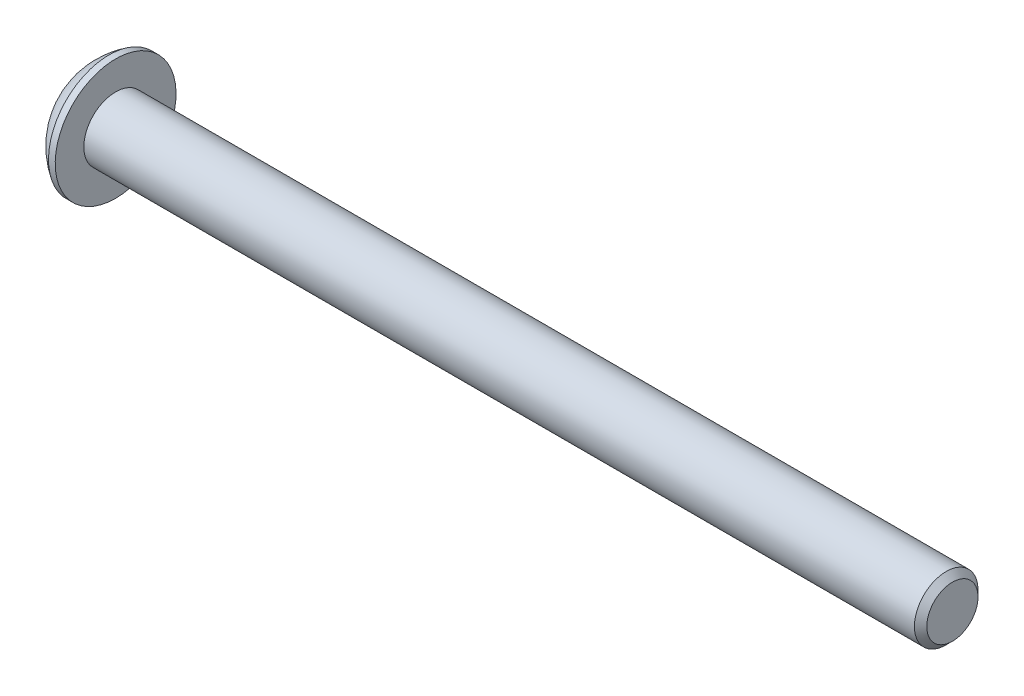
ISO-10303-21;
HEADER;
FILE_DESCRIPTION(('STEP AP214'),'2;1');
FILE_NAME('part.step','',(''),(''),'','','');
FILE_SCHEMA(('AUTOMOTIVE_DESIGN { 1 0 10303 214 1 1 1 1 }'));
ENDSEC;
DATA;
#1=APPLICATION_CONTEXT('core data for automotive mechanical design processes');
#2=APPLICATION_PROTOCOL_DEFINITION('international standard','automotive_design',2000,#1);
#3=PRODUCT_CONTEXT('',#1,'mechanical');
#4=PRODUCT('Part','Part','',(#3));
#5=PRODUCT_RELATED_PRODUCT_CATEGORY('part','',(#4));
#6=PRODUCT_DEFINITION_FORMATION('','',#4);
#7=PRODUCT_DEFINITION_CONTEXT('part definition',#1,'design');
#8=PRODUCT_DEFINITION('design','',#6,#7);
#9=PRODUCT_DEFINITION_SHAPE('','',#8);
#10=(LENGTH_UNIT() NAMED_UNIT(*) SI_UNIT(.MILLI.,.METRE.));
#11=(NAMED_UNIT(*) PLANE_ANGLE_UNIT() SI_UNIT($,.RADIAN.));
#12=(NAMED_UNIT(*) SI_UNIT($,.STERADIAN.) SOLID_ANGLE_UNIT());
#13=UNCERTAINTY_MEASURE_WITH_UNIT(LENGTH_MEASURE(1.E-05),#10,'distance_accuracy_value','');
#14=(GEOMETRIC_REPRESENTATION_CONTEXT(3) GLOBAL_UNCERTAINTY_ASSIGNED_CONTEXT((#13)) GLOBAL_UNIT_ASSIGNED_CONTEXT((#10,
#11,#12)) REPRESENTATION_CONTEXT('',''));
#15=CARTESIAN_POINT('',(0.,0.,0.));
#16=DIRECTION('',(0.,0.,1.));
#17=DIRECTION('',(1.,0.,0.));
#18=AXIS2_PLACEMENT_3D('',#15,#16,#17);
#19=CARTESIAN_POINT('',(1.77799999999984,-1.77615332584927E-12,-1.0547118733939E-12));
#20=DIRECTION('',(-1.,0.,0.));
#21=DIRECTION('',(0.,-1.,0.));
#22=AXIS2_PLACEMENT_3D('',#19,#20,#21);
#23=CONICAL_SURFACE('',#22,1.58750000000069,1.04719755119657);
#24=CARTESIAN_POINT('',(2.69454355233878,-1.7763568394003E-12,-1.11022302462516E-12));
#25=VERTEX_POINT('',#24);
#26=VERTEX_LOOP('',#25);
#27=FACE_BOUND('',#26,.T.);
#28=CARTESIAN_POINT('',(1.77800000000039,-1.77615332584927E-12,-1.0547118733939E-12));
#29=DIRECTION('',(-1.,0.,0.));
#30=DIRECTION('',(0.,-1.,0.));
#31=AXIS2_PLACEMENT_3D('',#28,#29,#30);
#32=CIRCLE('',#31,1.5874999999998);
#33=CARTESIAN_POINT('',(1.77800000000011,-1.77769549501942E-12,1.58749999999908));
#34=VERTEX_POINT('',#33);
#35=CARTESIAN_POINT('',(1.77800000000022,-1.37481532850896,0.793749999998839));
#36=VERTEX_POINT('',#35);
#37=EDGE_CURVE('E20',#34,#36,#32,.F.);
#38=ORIENTED_EDGE('',*,*,#37,.F.);
#39=CARTESIAN_POINT('',(1.77799999999984,-1.77615332584927E-12,-1.0547118733939E-12));
#40=DIRECTION('',(-1.,0.,0.));
#41=DIRECTION('',(0.,-1.,0.));
#42=AXIS2_PLACEMENT_3D('',#39,#40,#41);
#43=CIRCLE('',#42,1.58750000000069);
#44=CARTESIAN_POINT('',(1.77800000000009,1.37481532850634,0.793749999998971));
#45=VERTEX_POINT('',#44);
#46=EDGE_CURVE('E90',#45,#34,#43,.F.);
#47=ORIENTED_EDGE('',*,*,#46,.F.);
#48=CARTESIAN_POINT('',(1.77800000000035,-1.77615332584927E-12,-1.0547118733939E-12));
#49=DIRECTION('',(-1.,0.,0.));
#50=DIRECTION('',(0.,-1.,0.));
#51=AXIS2_PLACEMENT_3D('',#48,#49,#50);
#52=CIRCLE('',#51,1.5874999999998);
#53=CARTESIAN_POINT('',(1.77800000000016,1.37481532850581,-0.793750000001468));
#54=VERTEX_POINT('',#53);
#55=EDGE_CURVE('E106',#54,#45,#52,.F.);
#56=ORIENTED_EDGE('',*,*,#55,.F.);
#57=CARTESIAN_POINT('',(1.77799999999996,-1.77615332584927E-12,-1.0547118733939E-12));
#58=DIRECTION('',(-1.,0.,0.));
#59=DIRECTION('',(0.,-1.,0.));
#60=AXIS2_PLACEMENT_3D('',#57,#58,#59);
#61=CIRCLE('',#60,1.58750000000046);
#62=CARTESIAN_POINT('',(1.77800000000024,-1.47079020658031E-12,-1.58750000000116));
#63=VERTEX_POINT('',#62);
#64=EDGE_CURVE('E450',#63,#54,#61,.F.);
#65=ORIENTED_EDGE('',*,*,#64,.F.);
#66=CARTESIAN_POINT('',(1.77800000000052,-1.77615332584927E-12,-1.0547118733939E-12));
#67=DIRECTION('',(-1.,0.,0.));
#68=DIRECTION('',(0.,-1.,0.));
#69=AXIS2_PLACEMENT_3D('',#66,#67,#68);
#70=CIRCLE('',#69,1.58749999999958);
#71=CARTESIAN_POINT('',(1.77800000000045,-1.37481532850949,-0.793750000001181));
#72=VERTEX_POINT('',#71);
#73=EDGE_CURVE('E452',#72,#63,#70,.F.);
#74=ORIENTED_EDGE('',*,*,#73,.F.);
#75=CARTESIAN_POINT('',(1.77800000000039,-1.77615332584927E-12,-1.0547118733939E-12));
#76=DIRECTION('',(-1.,0.,0.));
#77=DIRECTION('',(0.,-1.,0.));
#78=AXIS2_PLACEMENT_3D('',#75,#76,#77);
#79=CIRCLE('',#78,1.5874999999998);
#80=EDGE_CURVE('E93',#36,#72,#79,.F.);
#81=ORIENTED_EDGE('',*,*,#80,.F.);
#82=EDGE_LOOP('',(#38,#47,#56,#65,#74,#81));
#83=FACE_BOUND('',#82,.T.);
#84=ADVANCED_FACE('F17',(#27,#83),#23,.F.);
#85=CARTESIAN_POINT('',(1.77800000000024,-9.99200722162641E-13,3.17499999999923));
#86=DIRECTION('',(-1.,0.,0.));
#87=DIRECTION('',(0.,-1.,0.));
#88=AXIS2_PLACEMENT_3D('',#85,#86,#87);
#89=PLANE('',#88);
#90=DIRECTION('',(0.,1.,0.));
#91=VECTOR('',#90,1.);
#92=CARTESIAN_POINT('',(1.77800000000026,-0.916543552339999,1.58749999999847));
#93=LINE('',#92,#91);
#94=CARTESIAN_POINT('',(1.77800000000015,-0.916543552339381,1.58749999999874));
#95=VERTEX_POINT('',#94);
#96=EDGE_CURVE('E109',#34,#95,#93,.F.);
#97=ORIENTED_EDGE('',*,*,#96,.F.);
#98=ORIENTED_EDGE('',*,*,#37,.T.);
#99=DIRECTION('',(0.,0.5,0.866025403784439));
#100=VECTOR('',#99,1.);
#101=CARTESIAN_POINT('',(1.77800000000006,-1.83308710467783,-1.2490009027033E-12));
#102=LINE('',#101,#100);
#103=EDGE_CURVE('E111',#95,#36,#102,.F.);
#104=ORIENTED_EDGE('',*,*,#103,.F.);
#105=EDGE_LOOP('',(#97,#98,#104));
#106=FACE_BOUND('',#105,.T.);
#107=ADVANCED_FACE('F110',(#106),#89,.T.);
#108=CARTESIAN_POINT('',(1.77800000000024,-9.99200722162641E-13,3.17499999999923));
#109=DIRECTION('',(-1.,0.,0.));
#110=DIRECTION('',(0.,-1.,0.));
#111=AXIS2_PLACEMENT_3D('',#108,#109,#110);
#112=PLANE('',#111);
#113=DIRECTION('',(0.,0.5,0.866025403784439));
#114=VECTOR('',#113,1.);
#115=CARTESIAN_POINT('',(1.77800000000049,-1.83308710467783,-1.2490009027033E-12));
#116=LINE('',#115,#114);
#117=CARTESIAN_POINT('',(1.77800000000029,-1.83308710467854,-1.51757723265582E-12));
#118=VERTEX_POINT('',#117);
#119=EDGE_CURVE('E171',#36,#118,#116,.F.);
#120=ORIENTED_EDGE('',*,*,#119,.F.);
#121=ORIENTED_EDGE('',*,*,#80,.T.);
#122=DIRECTION('',(0.,-0.5,0.866025403784439));
#123=VECTOR('',#122,1.);
#124=CARTESIAN_POINT('',(1.77800000000018,-0.916543552340277,-1.58750000000149));
#125=LINE('',#124,#123);
#126=EDGE_CURVE('E159',#118,#72,#125,.F.);
#127=ORIENTED_EDGE('',*,*,#126,.F.);
#128=EDGE_LOOP('',(#120,#121,#127));
#129=FACE_BOUND('',#128,.T.);
#130=ADVANCED_FACE('F249',(#129),#112,.T.);
#131=CARTESIAN_POINT('',(1.77800000000024,-9.99200722162641E-13,3.17499999999923));
#132=DIRECTION('',(-1.,0.,0.));
#133=DIRECTION('',(0.,-1.,0.));
#134=AXIS2_PLACEMENT_3D('',#131,#132,#133);
#135=PLANE('',#134);
#136=DIRECTION('',(0.,-0.5,0.866025403784439));
#137=VECTOR('',#136,1.);
#138=CARTESIAN_POINT('',(1.77800000000012,-0.916543552340277,-1.58750000000149));
#139=LINE('',#138,#137);
#140=CARTESIAN_POINT('',(1.77800000000018,-0.916543552340486,-1.58750000000164));
#141=VERTEX_POINT('',#140);
#142=EDGE_CURVE('E156',#72,#141,#139,.F.);
#143=ORIENTED_EDGE('',*,*,#142,.F.);
#144=ORIENTED_EDGE('',*,*,#73,.T.);
#145=DIRECTION('',(0.,-1.,0.));
#146=VECTOR('',#145,1.);
#147=CARTESIAN_POINT('',(1.7780000000002,0.916543552336946,-1.58750000000168));
#148=LINE('',#147,#146);
#149=EDGE_CURVE('E143',#141,#63,#148,.F.);
#150=ORIENTED_EDGE('',*,*,#149,.F.);
#151=EDGE_LOOP('',(#143,#144,#150));
#152=FACE_BOUND('',#151,.T.);
#153=ADVANCED_FACE('F245',(#152),#135,.T.);
#154=CARTESIAN_POINT('',(1.77800000000024,-9.99200722162641E-13,3.17499999999923));
#155=DIRECTION('',(-1.,0.,0.));
#156=DIRECTION('',(0.,-1.,0.));
#157=AXIS2_PLACEMENT_3D('',#154,#155,#156);
#158=PLANE('',#157);
#159=DIRECTION('',(0.,-1.,0.));
#160=VECTOR('',#159,1.);
#161=CARTESIAN_POINT('',(1.77800000000023,0.916543552336946,-1.58750000000168));
#162=LINE('',#161,#160);
#163=CARTESIAN_POINT('',(1.77800000000027,0.916543552336838,-1.58750000000152));
#164=VERTEX_POINT('',#163);
#165=EDGE_CURVE('E140',#63,#164,#162,.F.);
#166=ORIENTED_EDGE('',*,*,#165,.F.);
#167=ORIENTED_EDGE('',*,*,#64,.T.);
#168=DIRECTION('',(0.,-0.5,-0.866025403784439));
#169=VECTOR('',#168,1.);
#170=CARTESIAN_POINT('',(1.77800000000031,1.83308710467567,-8.88178419700125E-13));
#171=LINE('',#170,#169);
#172=EDGE_CURVE('E128',#164,#54,#171,.F.);
#173=ORIENTED_EDGE('',*,*,#172,.F.);
#174=EDGE_LOOP('',(#166,#167,#173));
#175=FACE_BOUND('',#174,.T.);
#176=ADVANCED_FACE('F241',(#175),#158,.T.);
#177=CARTESIAN_POINT('',(1.77800000000024,-9.99200722162641E-13,3.17499999999923));
#178=DIRECTION('',(-1.,0.,0.));
#179=DIRECTION('',(0.,-1.,0.));
#180=AXIS2_PLACEMENT_3D('',#177,#178,#179);
#181=PLANE('',#180);
#182=DIRECTION('',(0.,-0.5,-0.866025403784439));
#183=VECTOR('',#182,1.);
#184=CARTESIAN_POINT('',(1.77800000000023,1.83308710467567,-8.88178419700125E-13));
#185=LINE('',#184,#183);
#186=CARTESIAN_POINT('',(1.77800000000041,1.83308710467544,-1.3320539535005E-12));
#187=VERTEX_POINT('',#186);
#188=EDGE_CURVE('E125',#54,#187,#185,.F.);
#189=ORIENTED_EDGE('',*,*,#188,.F.);
#190=ORIENTED_EDGE('',*,*,#55,.T.);
#191=DIRECTION('',(0.,0.5,-0.866025403784439));
#192=VECTOR('',#191,1.);
#193=CARTESIAN_POINT('',(1.77800000000058,0.916543552337223,1.58749999999794));
#194=LINE('',#193,#192);
#195=EDGE_CURVE('E148',#187,#45,#194,.F.);
#196=ORIENTED_EDGE('',*,*,#195,.F.);
#197=EDGE_LOOP('',(#189,#190,#196));
#198=FACE_BOUND('',#197,.T.);
#199=ADVANCED_FACE('F238',(#198),#181,.T.);
#200=CARTESIAN_POINT('',(1.77800000000024,-9.99200722162641E-13,3.17499999999923));
#201=DIRECTION('',(-1.,0.,0.));
#202=DIRECTION('',(0.,-1.,0.));
#203=AXIS2_PLACEMENT_3D('',#200,#201,#202);
#204=PLANE('',#203);
#205=DIRECTION('',(0.,0.5,-0.866025403784439));
#206=VECTOR('',#205,1.);
#207=CARTESIAN_POINT('',(1.77800000000017,0.916543552337223,1.58749999999794));
#208=LINE('',#207,#206);
#209=CARTESIAN_POINT('',(1.77800000000026,0.916543552337077,1.5874999999982));
#210=VERTEX_POINT('',#209);
#211=EDGE_CURVE('E104',#45,#210,#208,.F.);
#212=ORIENTED_EDGE('',*,*,#211,.F.);
#213=ORIENTED_EDGE('',*,*,#46,.T.);
#214=DIRECTION('',(0.,1.,0.));
#215=VECTOR('',#214,1.);
#216=CARTESIAN_POINT('',(1.77800000000042,-0.916543552339999,1.58749999999847));
#217=LINE('',#216,#215);
#218=EDGE_CURVE('E101',#210,#34,#217,.F.);
#219=ORIENTED_EDGE('',*,*,#218,.F.);
#220=EDGE_LOOP('',(#212,#213,#219));
#221=FACE_BOUND('',#220,.T.);
#222=ADVANCED_FACE('F99',(#221),#204,.T.);
#223=CARTESIAN_POINT('',(1.77800000000006,-0.916543552339999,1.58749999999847));
#224=DIRECTION('',(0.,0.,-1.));
#225=DIRECTION('',(0.,1.,0.));
#226=AXIS2_PLACEMENT_3D('',#223,#224,#225);
#227=PLANE('',#226);
#228=DIRECTION('',(0.,-1.,0.));
#229=VECTOR('',#228,1.);
#230=CARTESIAN_POINT('',(0.,0.,1.58749999999863));
#231=LINE('',#230,#229);
#232=CARTESIAN_POINT('',(1.49237097321749E-13,0.916543552337015,1.58749999999838));
#233=VERTEX_POINT('',#232);
#234=CARTESIAN_POINT('',(2.27197896965218E-13,-0.916543552339712,1.58749999999866));
#235=VERTEX_POINT('',#234);
#236=EDGE_CURVE('E132',#233,#235,#231,.T.);
#237=ORIENTED_EDGE('',*,*,#236,.F.);
#238=DIRECTION('',(1.,0.,0.));
#239=VECTOR('',#238,1.);
#240=CARTESIAN_POINT('',(1.77800000000042,0.916543552337223,1.58749999999794));
#241=LINE('',#240,#239);
#242=EDGE_CURVE('E117',#210,#233,#241,.F.);
#243=ORIENTED_EDGE('',*,*,#242,.F.);
#244=ORIENTED_EDGE('',*,*,#218,.T.);
#245=ORIENTED_EDGE('',*,*,#96,.T.);
#246=DIRECTION('',(1.,0.,0.));
#247=VECTOR('',#246,1.);
#248=CARTESIAN_POINT('',(1.77800000000018,-0.916543552339111,1.58749999999908));
#249=LINE('',#248,#247);
#250=EDGE_CURVE('E168',#235,#95,#249,.T.);
#251=ORIENTED_EDGE('',*,*,#250,.F.);
#252=EDGE_LOOP('',(#237,#243,#244,#245,#251));
#253=FACE_BOUND('',#252,.T.);
#254=ADVANCED_FACE('F115',(#253),#227,.T.);
#255=CARTESIAN_POINT('',(1.77800000000018,-1.83308710467783,-1.2490009027033E-12));
#256=DIRECTION('',(0.,0.866025403784439,-0.5));
#257=DIRECTION('',(0.,0.5,0.866025403784439));
#258=AXIS2_PLACEMENT_3D('',#255,#256,#257);
#259=PLANE('',#258);
#260=DIRECTION('',(0.,-0.500000000000086,-0.866025403784389));
#261=VECTOR('',#260,1.);
#262=CARTESIAN_POINT('',(0.,-0.916543552339388,1.58749999999924));
#263=LINE('',#262,#261);
#264=CARTESIAN_POINT('',(2.82658169808732E-13,-1.83308710467821,-1.25507878209497E-12));
#265=VERTEX_POINT('',#264);
#266=EDGE_CURVE('E436',#235,#265,#263,.T.);
#267=ORIENTED_EDGE('',*,*,#266,.F.);
#268=ORIENTED_EDGE('',*,*,#250,.T.);
#269=ORIENTED_EDGE('',*,*,#103,.T.);
#270=ORIENTED_EDGE('',*,*,#119,.T.);
#271=DIRECTION('',(1.,0.,0.));
#272=VECTOR('',#271,1.);
#273=CARTESIAN_POINT('',(1.7780000000002,-1.83308710467885,-1.41098070727264E-12));
#274=LINE('',#273,#272);
#275=EDGE_CURVE('E153',#265,#118,#274,.T.);
#276=ORIENTED_EDGE('',*,*,#275,.F.);
#277=EDGE_LOOP('',(#267,#268,#269,#270,#276));
#278=FACE_BOUND('',#277,.T.);
#279=ADVANCED_FACE('F229',(#278),#259,.T.);
#280=CARTESIAN_POINT('',(1.7780000000002,-0.916543552340277,-1.58750000000149));
#281=DIRECTION('',(0.,0.866025403784439,0.5));
#282=DIRECTION('',(0.,-0.5,0.866025403784439));
#283=AXIS2_PLACEMENT_3D('',#280,#281,#282);
#284=PLANE('',#283);
#285=DIRECTION('',(0.,0.499999999999521,-0.866025403784715));
#286=VECTOR('',#285,1.);
#287=CARTESIAN_POINT('',(0.,-1.83308710467833,-1.11022302462516E-12));
#288=LINE('',#287,#286);
#289=CARTESIAN_POINT('',(2.584229195328E-13,-0.916543552340499,-1.58750000000155));
#290=VERTEX_POINT('',#289);
#291=EDGE_CURVE('E433',#265,#290,#288,.T.);
#292=ORIENTED_EDGE('',*,*,#291,.F.);
#293=ORIENTED_EDGE('',*,*,#275,.T.);
#294=ORIENTED_EDGE('',*,*,#126,.T.);
#295=ORIENTED_EDGE('',*,*,#142,.T.);
#296=DIRECTION('',(1.,0.,0.));
#297=VECTOR('',#296,1.);
#298=CARTESIAN_POINT('',(1.77800000000031,-0.916543552340721,-1.58750000000168));
#299=LINE('',#298,#297);
#300=EDGE_CURVE('E137',#290,#141,#299,.T.);
#301=ORIENTED_EDGE('',*,*,#300,.F.);
#302=EDGE_LOOP('',(#292,#293,#294,#295,#301));
#303=FACE_BOUND('',#302,.T.);
#304=ADVANCED_FACE('F225',(#303),#284,.T.);
#305=CARTESIAN_POINT('',(1.77800000000031,0.916543552336946,-1.58750000000168));
#306=DIRECTION('',(0.,0.,1.));
#307=DIRECTION('',(0.,-1.,0.));
#308=AXIS2_PLACEMENT_3D('',#305,#306,#307);
#309=PLANE('',#308);
#310=DIRECTION('',(0.,-1.,0.));
#311=VECTOR('',#310,1.);
#312=CARTESIAN_POINT('',(0.,0.,-1.58750000000155));
#313=LINE('',#312,#311);
#314=CARTESIAN_POINT('',(2.18626036360821E-13,0.916543552336963,-1.58750000000158));
#315=VERTEX_POINT('',#314);
#316=EDGE_CURVE('E430',#290,#315,#313,.F.);
#317=ORIENTED_EDGE('',*,*,#316,.F.);
#318=ORIENTED_EDGE('',*,*,#300,.T.);
#319=ORIENTED_EDGE('',*,*,#149,.T.);
#320=ORIENTED_EDGE('',*,*,#165,.T.);
#321=DIRECTION('',(1.,0.,0.));
#322=VECTOR('',#321,1.);
#323=CARTESIAN_POINT('',(1.77800000000058,0.916543552336847,-1.58750000000139));
#324=LINE('',#323,#322);
#325=EDGE_CURVE('E127',#315,#164,#324,.T.);
#326=ORIENTED_EDGE('',*,*,#325,.F.);
#327=EDGE_LOOP('',(#317,#318,#319,#320,#326));
#328=FACE_BOUND('',#327,.T.);
#329=ADVANCED_FACE('F222',(#328),#309,.T.);
#330=CARTESIAN_POINT('',(1.77800000000058,1.83308710467567,-8.88178419700125E-13));
#331=DIRECTION('',(0.,-0.866025403784439,0.5));
#332=DIRECTION('',(0.,-0.5,-0.866025403784439));
#333=AXIS2_PLACEMENT_3D('',#330,#331,#332);
#334=PLANE('',#333);
#335=DIRECTION('',(0.,0.499999999999931,0.866025403784479));
#336=VECTOR('',#335,1.);
#337=CARTESIAN_POINT('',(0.,0.916543552337112,-1.58750000000155));
#338=LINE('',#337,#336);
#339=CARTESIAN_POINT('',(1.04185165334096E-13,1.83308710467557,-1.20157430012757E-12));
#340=VERTEX_POINT('',#339);
#341=EDGE_CURVE('E427',#315,#340,#338,.T.);
#342=ORIENTED_EDGE('',*,*,#341,.F.);
#343=ORIENTED_EDGE('',*,*,#325,.T.);
#344=ORIENTED_EDGE('',*,*,#172,.T.);
#345=ORIENTED_EDGE('',*,*,#188,.T.);
#346=DIRECTION('',(1.,0.,0.));
#347=VECTOR('',#346,1.);
#348=CARTESIAN_POINT('',(1.77800000000042,1.83308710467545,-1.53045978668054E-12));
#349=LINE('',#348,#347);
#350=EDGE_CURVE('E35',#340,#187,#349,.T.);
#351=ORIENTED_EDGE('',*,*,#350,.F.);
#352=EDGE_LOOP('',(#342,#343,#344,#345,#351));
#353=FACE_BOUND('',#352,.T.);
#354=ADVANCED_FACE('F218',(#353),#334,.T.);
#355=CARTESIAN_POINT('',(1.77800000000042,0.916543552337223,1.58749999999794));
#356=DIRECTION('',(0.,-0.866025403784439,-0.5));
#357=DIRECTION('',(0.,0.5,-0.866025403784439));
#358=AXIS2_PLACEMENT_3D('',#355,#356,#357);
#359=PLANE('',#358);
#360=DIRECTION('',(0.,-0.499999999999979,0.866025403784451));
#361=VECTOR('',#360,1.);
#362=CARTESIAN_POINT('',(0.,1.8330871046755,-1.49880108324396E-12));
#363=LINE('',#362,#361);
#364=EDGE_CURVE('E204',#340,#233,#363,.T.);
#365=ORIENTED_EDGE('',*,*,#364,.F.);
#366=ORIENTED_EDGE('',*,*,#350,.T.);
#367=ORIENTED_EDGE('',*,*,#195,.T.);
#368=ORIENTED_EDGE('',*,*,#211,.T.);
#369=ORIENTED_EDGE('',*,*,#242,.T.);
#370=EDGE_LOOP('',(#365,#366,#367,#368,#369));
#371=FACE_BOUND('',#370,.T.);
#372=ADVANCED_FACE('F214',(#371),#359,.T.);
#373=CARTESIAN_POINT('',(0.,0.,0.));
#374=DIRECTION('',(-1.,0.,0.));
#375=DIRECTION('',(0.,-1.,0.));
#376=AXIS2_PLACEMENT_3D('',#373,#374,#375);
#377=PLANE('',#376);
#378=ORIENTED_EDGE('',*,*,#341,.T.);
#379=ORIENTED_EDGE('',*,*,#364,.T.);
#380=ORIENTED_EDGE('',*,*,#236,.T.);
#381=ORIENTED_EDGE('',*,*,#266,.T.);
#382=ORIENTED_EDGE('',*,*,#291,.T.);
#383=ORIENTED_EDGE('',*,*,#316,.T.);
#384=EDGE_LOOP('',(#378,#379,#380,#381,#382,#383));
#385=FACE_BOUND('',#384,.T.);
#386=CARTESIAN_POINT('',(0.,2.29234999999897,-1.61029130033495E-12));
#387=CARTESIAN_POINT('',(0.,2.29234961429854,0.0643619991851128));
#388=CARTESIAN_POINT('',(0.,2.28963695190005,0.128735826627769));
#389=CARTESIAN_POINT('',(0.,2.27880393843545,0.257038618983704));
#390=CARTESIAN_POINT('',(0.,2.27068199085023,0.320967446927587));
#391=CARTESIAN_POINT('',(0.,2.24906694794153,0.448021254606155));
#392=CARTESIAN_POINT('',(-2.11145657803834E-13,2.23556532653357,0.511144793380304));
#393=CARTESIAN_POINT('',(2.1230338726406E-13,2.2032840049554,0.636065176147778));
#394=CARTESIAN_POINT('',(7.91307667045218E-13,2.1845000215901,0.697860899532398));
#395=CARTESIAN_POINT('',(1.31527370784973E-12,2.12048422735698,0.880329802926232));
#396=CARTESIAN_POINT('',(0.,2.06753599079354,0.998391795926612));
#397=CARTESIAN_POINT('',(0.,1.94254204858566,1.22393765941999));
#398=CARTESIAN_POINT('',(1.09426987255997E-12,1.87049561696535,1.33142112758061));
#399=CARTESIAN_POINT('',(6.78265571815648E-13,1.74974254194772,1.4823771967079));
#400=CARTESIAN_POINT('',(1.8196260116122E-13,1.70734573132192,1.53101280076593));
#401=CARTESIAN_POINT('',(-1.8104901033499E-13,1.61863910291419,1.62450601319041));
#402=CARTESIAN_POINT('',(0.,1.57233309727202,1.66936721890274));
#403=CARTESIAN_POINT('',(0.,1.47608431707122,1.75504884203878));
#404=CARTESIAN_POINT('',(0.,1.42613990458882,1.7958674198137));
#405=CARTESIAN_POINT('',(0.,1.32299452541138,1.87315615311381));
#406=CARTESIAN_POINT('',(0.,1.26979280714074,1.90962529930556));
#407=CARTESIAN_POINT('',(0.,1.10588180153837,2.0120772215095));
#408=CARTESIAN_POINT('',(0.,0.990764947000144,2.07119486286527));
#409=CARTESIAN_POINT('',(0.,0.752302198838524,2.16922858468718));
#410=CARTESIAN_POINT('',(0.,0.628956393120053,2.20814488091312));
#411=CARTESIAN_POINT('',(0.,0.377466101732035,2.26472755765783));
#412=CARTESIAN_POINT('',(0.,0.249321590439132,2.28239382469242));
#413=CARTESIAN_POINT('',(0.,-0.00811435371738163,2.29595665980819));
#414=CARTESIAN_POINT('',(0.,-0.137405786580993,2.29185322788936));
#415=CARTESIAN_POINT('',(0.,-0.39344938693504,2.26200962408923));
#416=CARTESIAN_POINT('',(0.,-0.520201567982411,2.23626956775629));
#417=CARTESIAN_POINT('',(0.,-0.767645294385805,2.16383549332549));
#418=CARTESIAN_POINT('',(0.,-0.888336774994924,2.11714125142547));
#419=CARTESIAN_POINT('',(0.,-1.06210572146795,2.03247976453514));
#420=CARTESIAN_POINT('',(0.,-1.11884498714206,2.00180278323556));
#421=CARTESIAN_POINT('',(0.,-1.22954062855713,1.93578011657895));
#422=CARTESIAN_POINT('',(0.,-1.28349764565534,1.90043551394109));
#423=CARTESIAN_POINT('',(0.,-1.3882167664168,1.82534174602206));
#424=CARTESIAN_POINT('',(0.,-1.43898030563171,1.78559458231361));
#425=CARTESIAN_POINT('',(0.,-1.53701984534575,1.70193996292219));
#426=CARTESIAN_POINT('',(0.,-1.58429243280695,1.65802852923984));
#427=CARTESIAN_POINT('',(0.,-1.72023903553904,1.52059650553994));
#428=CARTESIAN_POINT('',(0.,-1.80318066138386,1.42127847626374));
#429=CARTESIAN_POINT('',(0.,-1.95118232345247,1.21011519784516));
#430=CARTESIAN_POINT('',(0.,-2.01624303935734,1.09827042509123));
#431=CARTESIAN_POINT('',(0.,-2.09907772661465,0.923538238004328));
#432=CARTESIAN_POINT('',(0.,-2.12425103063709,0.864058373980449));
#433=CARTESIAN_POINT('',(0.,-2.16947990046716,0.743221562174071));
#434=CARTESIAN_POINT('',(0.,-2.18953960800835,0.681866178861829));
#435=CARTESIAN_POINT('',(0.,-2.22438542051308,0.557786972398809));
#436=CARTESIAN_POINT('',(0.,-2.2391798529497,0.495065478126618));
#437=CARTESIAN_POINT('',(0.,-2.26343456384605,0.368611258321946));
#438=CARTESIAN_POINT('',(0.,-2.27289641559437,0.304878836757992));
#439=CARTESIAN_POINT('',(0.,-2.28388649696888,0.200873029359036));
#440=CARTESIAN_POINT('',(0.,-2.28705930623446,0.160766164178505));
#441=CARTESIAN_POINT('',(0.,-2.29129117827197,0.0804410725416702));
#442=CARTESIAN_POINT('',(0.,-2.2923502410439,0.040222846085366));
#443=CARTESIAN_POINT('',(0.,-2.29234961430109,-0.0643619991883337));
#444=CARTESIAN_POINT('',(0.,-2.2896369519026,-0.12873582663099));
#445=CARTESIAN_POINT('',(0.,-2.278803938438,-0.257038618986924));
#446=CARTESIAN_POINT('',(0.,-2.27068199085278,-0.320967446930807));
#447=CARTESIAN_POINT('',(0.,-2.24906694794407,-0.448021254609375));
#448=CARTESIAN_POINT('',(-2.11936368114192E-13,-2.23556532653612,-0.511144793383526));
#449=CARTESIAN_POINT('',(2.11122688150977E-13,-2.20328400495795,-0.636065176151));
#450=CARTESIAN_POINT('',(7.89683247567266E-13,-2.18450002159265,-0.69786089953562));
#451=CARTESIAN_POINT('',(1.31331890218383E-12,-2.12048422735953,-0.880329802929452));
#452=CARTESIAN_POINT('',(0.,-2.06753599079609,-0.998391795929832));
#453=CARTESIAN_POINT('',(0.,-1.94254204858821,-1.22393765942321));
#454=CARTESIAN_POINT('',(1.09214359825212E-12,-1.8704956169679,-1.33142112758383));
#455=CARTESIAN_POINT('',(6.76726880294543E-13,-1.74974254195026,-1.48237719671112));
#456=CARTESIAN_POINT('',(1.81017121035898E-13,-1.70734573132446,-1.53101280076915));
#457=CARTESIAN_POINT('',(-1.81580744739604E-13,-1.61863910291674,-1.62450601319363));
#458=CARTESIAN_POINT('',(0.,-1.57233309727457,-1.66936721890596));
#459=CARTESIAN_POINT('',(0.,-1.47608431707377,-1.755048842042));
#460=CARTESIAN_POINT('',(0.,-1.42613990459137,-1.79586741981692));
#461=CARTESIAN_POINT('',(0.,-1.32299452541392,-1.87315615311703));
#462=CARTESIAN_POINT('',(0.,-1.26979280714329,-1.90962529930878));
#463=CARTESIAN_POINT('',(0.,-1.10588180154092,-2.01207722151272));
#464=CARTESIAN_POINT('',(0.,-0.990764947002692,-2.07119486286849));
#465=CARTESIAN_POINT('',(0.,-0.752302198841072,-2.1692285846904));
#466=CARTESIAN_POINT('',(0.,-0.628956393122601,-2.20814488091634));
#467=CARTESIAN_POINT('',(0.,-0.377466101734584,-2.26472755766105));
#468=CARTESIAN_POINT('',(0.,-0.249321590441681,-2.28239382469564));
#469=CARTESIAN_POINT('',(0.,0.00811435371483254,-2.29595665981141));
#470=CARTESIAN_POINT('',(0.,0.137405786578444,-2.29185322789258));
#471=CARTESIAN_POINT('',(0.,0.393449386932491,-2.26200962409245));
#472=CARTESIAN_POINT('',(0.,0.520201567979862,-2.23626956775951));
#473=CARTESIAN_POINT('',(0.,0.767645294383256,-2.16383549332871));
#474=CARTESIAN_POINT('',(0.,0.888336774992374,-2.11714125142869));
#475=CARTESIAN_POINT('',(0.,1.0621057214654,-2.03247976453836));
#476=CARTESIAN_POINT('',(0.,1.11884498713951,-2.00180278323877));
#477=CARTESIAN_POINT('',(0.,1.22954062855458,-1.93578011658217));
#478=CARTESIAN_POINT('',(0.,1.28349764565279,-1.90043551394431));
#479=CARTESIAN_POINT('',(0.,1.38821676641425,-1.82534174602528));
#480=CARTESIAN_POINT('',(0.,1.43898030562917,-1.78559458231683));
#481=CARTESIAN_POINT('',(0.,1.5370198453432,-1.70193996292541));
#482=CARTESIAN_POINT('',(0.,1.5842924328044,-1.65802852924305));
#483=CARTESIAN_POINT('',(0.,1.72023903553649,-1.52059650554316));
#484=CARTESIAN_POINT('',(0.,1.8031806613813,-1.42127847626695));
#485=CARTESIAN_POINT('',(0.,1.95118232344991,-1.21011519784837));
#486=CARTESIAN_POINT('',(0.,2.01624303935478,-1.09827042509445));
#487=CARTESIAN_POINT('',(0.,2.0990777266121,-0.923538238007545));
#488=CARTESIAN_POINT('',(0.,2.12425103063454,-0.864058373983667));
#489=CARTESIAN_POINT('',(0.,2.16947990046461,-0.743221562177289));
#490=CARTESIAN_POINT('',(0.,2.1895396080058,-0.681866178865046));
#491=CARTESIAN_POINT('',(0.,2.22438542051052,-0.557786972402025));
#492=CARTESIAN_POINT('',(0.,2.23917985294715,-0.495065478129835));
#493=CARTESIAN_POINT('',(0.,2.2634345638435,-0.368611258325164));
#494=CARTESIAN_POINT('',(0.,2.27289641559182,-0.30487883676121));
#495=CARTESIAN_POINT('',(0.,2.28388649696633,-0.200873029362255));
#496=CARTESIAN_POINT('',(0.,2.28705930623191,-0.160766164181724));
#497=CARTESIAN_POINT('',(0.,2.29129117826942,-0.0804410725448901));
#498=CARTESIAN_POINT('',(0.,2.29235024104135,-0.0402228460885864));
#499=CARTESIAN_POINT('',(0.,2.29234999999897,-1.61029130033495E-12));
#500=B_SPLINE_CURVE_WITH_KNOTS('',3,(#386,#387,#388,#389,#390,#391,#392,#393,#394,#395,#396,
#397,#398,#399,#400,#401,#402,#403,#404,#405,#406,#407,#408,#409,#410,#411,#412,#413,#414,#415,
#416,#417,#418,#419,#420,#421,#422,#423,#424,#425,#426,#427,#428,#429,#430,#431,#432,#433,#434,
#435,#436,#437,#438,#439,#440,#441,#442,#443,#444,#445,#446,#447,#448,#449,#450,#451,#452,#453,
#454,#455,#456,#457,#458,#459,#460,#461,#462,#463,#464,#465,#466,#467,#468,#469,#470,#471,#472,
#473,#474,#475,#476,#477,#478,#479,#480,#481,#482,#483,#484,#485,#486,#487,#488,#489,#490,#491,
#492,#493,#494,#495,#496,#497,#498,#499),.UNSPECIFIED.,.T.,.F.,(4,2,2,2,2,2,2,2,2,2,2,2,2,2,2,2,
2,2,2,2,2,2,2,2,2,2,2,2,2,2,2,2,2,2,2,2,2,2,2,2,2,2,2,2,2,2,2,2,2,2,2,2,2,2,2,2,4),(0.,
0.193048968618054,0.386154939782435,0.579568183996019,0.77313871149112,1.1593570386459,
1.54559004914661,1.73895960916387,1.93214273180084,2.12541336477244,2.31872876140913,
2.70495649282647,3.09118009906616,3.47740576789469,3.86363143672326,4.24985504296299,
4.63608277438029,4.82939817101671,5.02266880398801,5.21585192662475,5.4092214866418,
5.79545449714279,6.1816728242979,6.37524335179329,6.56865659600711,6.76176256717161,
6.95481153578982,7.07545693291997,7.19610233005014,7.38915129866819,7.58225726983257,
7.77567051404616,7.96924104154126,8.35545936869603,8.74169237919675,8.935061939214,
9.12824506185097,9.32151569482258,9.51483109145927,9.90105882287661,10.2872824291163,
10.6735080979448,11.0597337667734,11.4459573730131,11.8321851044304,12.0255005010668,
12.2187711340381,12.4119542566749,12.6053238166919,12.9915568271929,13.377775154348,
13.5713456818434,13.7647589260572,13.9578648972217,14.15091386584,14.2715592629701,
14.3922046601003),.UNSPECIFIED.);
#501=CARTESIAN_POINT('',(0.,2.29234999999897,-1.61029130033495E-12));
#502=VERTEX_POINT('',#501);
#503=EDGE_CURVE('E197',#502,#502,#500,.T.);
#504=ORIENTED_EDGE('',*,*,#503,.F.);
#505=EDGE_LOOP('',(#504));
#506=FACE_BOUND('',#505,.T.);
#507=ADVANCED_FACE('F210',(#385,#506),#377,.T.);
#508=CARTESIAN_POINT('',(4.8598960648147,-1.27675647831893E-12,-1.60982338570648E-12));
#509=DIRECTION('',(0.,1.,0.));
#510=DIRECTION('',(1.,0.,0.));
#511=AXIS2_PLACEMENT_3D('',#508,#509,#510);
#512=SPHERICAL_SURFACE('',#511,5.37340285883187);
#513=CARTESIAN_POINT('',(2.05739999999997,0.,0.));
#514=DIRECTION('',(-1.,0.,0.));
#515=DIRECTION('',(0.,-1.,0.));
#516=AXIS2_PLACEMENT_3D('',#513,#514,#515);
#517=CIRCLE('',#516,4.5847);
#518=CARTESIAN_POINT('',(2.05739999999997,-4.5847,0.));
#519=VERTEX_POINT('',#518);
#520=EDGE_CURVE('E194',#519,#519,#517,.F.);
#521=ORIENTED_EDGE('',*,*,#520,.F.);
#522=EDGE_LOOP('',(#521));
#523=FACE_BOUND('',#522,.T.);
#524=ORIENTED_EDGE('',*,*,#503,.T.);
#525=EDGE_LOOP('',(#524));
#526=FACE_BOUND('',#525,.T.);
#527=ADVANCED_FACE('F206',(#523,#526),#512,.T.);
#528=CARTESIAN_POINT('',(66.0654000000001,-1.83186799063151E-12,-1.2490009027033E-12));
#529=DIRECTION('',(-1.,0.,0.));
#530=DIRECTION('',(0.,-1.,0.));
#531=AXIS2_PLACEMENT_3D('',#528,#529,#530);
#532=PLANE('',#531);
#533=CARTESIAN_POINT('',(66.0654000000136,-1.83176365187169E-12,-1.2490009027033E-12));
#534=DIRECTION('',(-1.,0.,0.));
#535=DIRECTION('',(0.,0.,1.));
#536=AXIS2_PLACEMENT_3D('',#533,#534,#535);
#537=CIRCLE('',#536,1.94310000000666);
#538=CARTESIAN_POINT('',(66.0654000000136,-1.83176365187169E-12,1.94310000000542));
#539=VERTEX_POINT('',#538);
#540=EDGE_CURVE('E191',#539,#539,#537,.T.);
#541=ORIENTED_EDGE('',*,*,#540,.F.);
#542=EDGE_LOOP('',(#541));
#543=FACE_BOUND('',#542,.T.);
#544=ADVANCED_FACE('F277',(#543),#532,.F.);
#545=CARTESIAN_POINT('',(0.,0.,0.));
#546=DIRECTION('',(-1.,0.,0.));
#547=DIRECTION('',(0.,-1.,0.));
#548=AXIS2_PLACEMENT_3D('',#545,#546,#547);
#549=CYLINDRICAL_SURFACE('',#548,4.5847);
#550=ORIENTED_EDGE('',*,*,#520,.T.);
#551=EDGE_LOOP('',(#550));
#552=FACE_BOUND('',#551,.T.);
#553=CARTESIAN_POINT('',(2.56540000000034,0.,0.));
#554=DIRECTION('',(-1.,0.,0.));
#555=DIRECTION('',(0.,-1.,0.));
#556=AXIS2_PLACEMENT_3D('',#553,#554,#555);
#557=CIRCLE('',#556,4.5847);
#558=CARTESIAN_POINT('',(2.56540000000033,-4.5847,0.));
#559=VERTEX_POINT('',#558);
#560=EDGE_CURVE('E188',#559,#559,#557,.T.);
#561=ORIENTED_EDGE('',*,*,#560,.T.);
#562=EDGE_LOOP('',(#561));
#563=FACE_BOUND('',#562,.T.);
#564=ADVANCED_FACE('F274',(#552,#563),#549,.T.);
#565=CARTESIAN_POINT('',(65.5955000001427,-1.83176365187169E-12,-1.2490009027033E-12));
#566=DIRECTION('',(-1.,0.,0.));
#567=DIRECTION('',(0.,0.,1.));
#568=AXIS2_PLACEMENT_3D('',#565,#566,#567);
#569=CONICAL_SURFACE('',#568,2.41299999993441,0.785398163457933);
#570=CARTESIAN_POINT('',(65.5955,0.,0.));
#571=DIRECTION('',(-1.,0.,0.));
#572=DIRECTION('',(0.,-1.,0.));
#573=AXIS2_PLACEMENT_3D('',#570,#571,#572);
#574=CIRCLE('',#573,2.413);
#575=CARTESIAN_POINT('',(65.5955,-2.41300000000002,0.));
#576=VERTEX_POINT('',#575);
#577=EDGE_CURVE('E26',#576,#576,#574,.T.);
#578=ORIENTED_EDGE('',*,*,#577,.F.);
#579=EDGE_LOOP('',(#578));
#580=FACE_BOUND('',#579,.T.);
#581=ORIENTED_EDGE('',*,*,#540,.T.);
#582=EDGE_LOOP('',(#581));
#583=FACE_BOUND('',#582,.T.);
#584=ADVANCED_FACE('F267',(#580,#583),#569,.T.);
#585=CARTESIAN_POINT('',(2.56540000000019,2.41299999999822,-1.4432899320127E-12));
#586=DIRECTION('',(-1.,0.,0.));
#587=DIRECTION('',(0.,-1.,0.));
#588=AXIS2_PLACEMENT_3D('',#585,#586,#587);
#589=PLANE('',#588);
#590=CARTESIAN_POINT('',(2.56540000000034,0.,0.));
#591=DIRECTION('',(-1.,0.,0.));
#592=DIRECTION('',(0.,-1.,0.));
#593=AXIS2_PLACEMENT_3D('',#590,#591,#592);
#594=CIRCLE('',#593,2.413);
#595=CARTESIAN_POINT('',(2.56540000000034,-2.413,0.));
#596=VERTEX_POINT('',#595);
#597=EDGE_CURVE('E11',#596,#596,#594,.F.);
#598=ORIENTED_EDGE('',*,*,#597,.F.);
#599=EDGE_LOOP('',(#598));
#600=FACE_BOUND('',#599,.T.);
#601=ORIENTED_EDGE('',*,*,#560,.F.);
#602=EDGE_LOOP('',(#601));
#603=FACE_BOUND('',#602,.T.);
#604=ADVANCED_FACE('F261',(#600,#603),#589,.F.);
#605=CARTESIAN_POINT('',(0.,0.,0.));
#606=DIRECTION('',(-1.,0.,0.));
#607=DIRECTION('',(0.,-1.,0.));
#608=AXIS2_PLACEMENT_3D('',#605,#606,#607);
#609=CYLINDRICAL_SURFACE('',#608,2.413);
#610=ORIENTED_EDGE('',*,*,#597,.T.);
#611=EDGE_LOOP('',(#610));
#612=FACE_BOUND('',#611,.T.);
#613=ORIENTED_EDGE('',*,*,#577,.T.);
#614=EDGE_LOOP('',(#613));
#615=FACE_BOUND('',#614,.T.);
#616=ADVANCED_FACE('F259',(#612,#615),#609,.T.);
#617=CLOSED_SHELL('',(#84,#107,#130,#153,#176,#199,#222,#254,#279,#304,#329,#354,#372,#507,#527,
#544,#564,#584,#604,#616));
#618=MANIFOLD_SOLID_BREP('B1',#617);
#619=ADVANCED_BREP_SHAPE_REPRESENTATION('',(#18,#618),#14);
#620=SHAPE_DEFINITION_REPRESENTATION(#9,#619);
ENDSEC;
END-ISO-10303-21;
